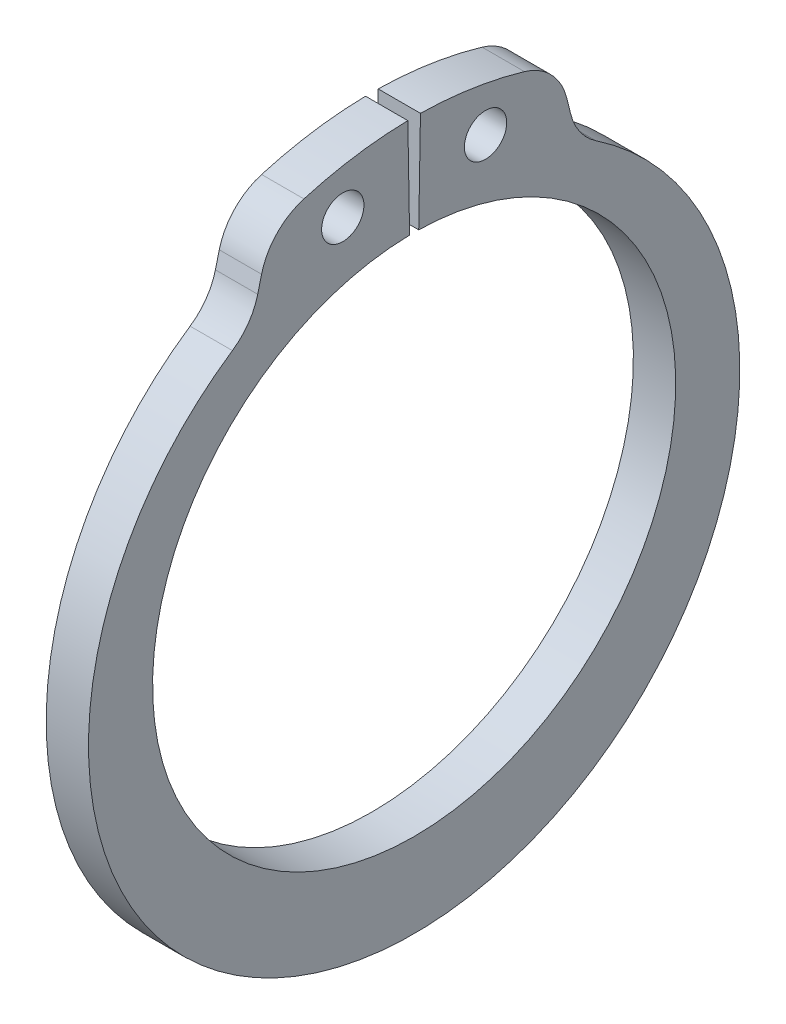
ISO-10303-21;
HEADER;
FILE_DESCRIPTION(('STEP AP214'),'2;1');
FILE_NAME('part.step','',(''),(''),'','','');
FILE_SCHEMA(('AUTOMOTIVE_DESIGN { 1 0 10303 214 1 1 1 1 }'));
ENDSEC;
DATA;
#1=APPLICATION_CONTEXT('core data for automotive mechanical design processes');
#2=APPLICATION_PROTOCOL_DEFINITION('international standard','automotive_design',2000,#1);
#3=PRODUCT_CONTEXT('',#1,'mechanical');
#4=PRODUCT('Part','Part','',(#3));
#5=PRODUCT_RELATED_PRODUCT_CATEGORY('part','',(#4));
#6=PRODUCT_DEFINITION_FORMATION('','',#4);
#7=PRODUCT_DEFINITION_CONTEXT('part definition',#1,'design');
#8=PRODUCT_DEFINITION('design','',#6,#7);
#9=PRODUCT_DEFINITION_SHAPE('','',#8);
#10=(LENGTH_UNIT() NAMED_UNIT(*) SI_UNIT(.MILLI.,.METRE.));
#11=(NAMED_UNIT(*) PLANE_ANGLE_UNIT() SI_UNIT($,.RADIAN.));
#12=(NAMED_UNIT(*) SI_UNIT($,.STERADIAN.) SOLID_ANGLE_UNIT());
#13=UNCERTAINTY_MEASURE_WITH_UNIT(LENGTH_MEASURE(1.E-05),#10,'distance_accuracy_value','');
#14=(GEOMETRIC_REPRESENTATION_CONTEXT(3) GLOBAL_UNCERTAINTY_ASSIGNED_CONTEXT((#13)) GLOBAL_UNIT_ASSIGNED_CONTEXT((#10,
#11,#12)) REPRESENTATION_CONTEXT('',''));
#15=CARTESIAN_POINT('',(0.,0.,0.));
#16=DIRECTION('',(0.,0.,1.));
#17=DIRECTION('',(1.,0.,0.));
#18=AXIS2_PLACEMENT_3D('',#15,#16,#17);
#19=CARTESIAN_POINT('',(1.1811,0.,0.));
#20=DIRECTION('',(1.,0.,0.));
#21=DIRECTION('',(0.,0.,-1.));
#22=AXIS2_PLACEMENT_3D('',#19,#20,#21);
#23=PLANE('',#22);
#24=CARTESIAN_POINT('',(1.1811,17.3320681895196,3.98635962699142));
#25=DIRECTION('',(1.,0.,0.));
#26=DIRECTION('',(0.,0.,-1.));
#27=AXIS2_PLACEMENT_3D('',#24,#25,#26);
#28=CIRCLE('',#27,1.1811);
#29=CARTESIAN_POINT('',(1.1811,17.3320681895196,2.80525962699142));
#30=VERTEX_POINT('',#29);
#31=EDGE_CURVE('E218',#30,#30,#28,.T.);
#32=ORIENTED_EDGE('',*,*,#31,.F.);
#33=EDGE_LOOP('',(#32));
#34=FACE_BOUND('',#33,.T.);
#35=CARTESIAN_POINT('',(1.1811,-1.82915405372659,-0.0319280027715097));
#36=DIRECTION('',(1.,0.,0.));
#37=DIRECTION('',(0.,0.,-1.));
#38=AXIS2_PLACEMENT_3D('',#35,#36,#37);
#39=CIRCLE('',#38,22.0224326851856);
#40=CARTESIAN_POINT('',(1.1811,20.189924508293,0.352416443188067));
#41=VERTEX_POINT('',#40);
#42=CARTESIAN_POINT('',(1.1811,19.3059941721494,6.15620991131703));
#43=VERTEX_POINT('',#42);
#44=EDGE_CURVE('E135',#41,#43,#39,.T.);
#45=ORIENTED_EDGE('',*,*,#44,.T.);
#46=CARTESIAN_POINT('',(1.1811,16.0151486828007,5.19268670701256));
#47=DIRECTION('',(1.,0.,0.));
#48=DIRECTION('',(0.,0.,-1.));
#49=AXIS2_PLACEMENT_3D('',#46,#47,#48);
#50=CIRCLE('',#49,3.429);
#51=CARTESIAN_POINT('',(1.1811,16.844698862812,8.51983075241296));
#52=VERTEX_POINT('',#51);
#53=EDGE_CURVE('E172',#43,#52,#50,.T.);
#54=ORIENTED_EDGE('',*,*,#53,.T.);
#55=DIRECTION('',(0.,-0.970295726275998,0.241921895599662));
#56=VECTOR('',#55,1.);
#57=CARTESIAN_POINT('',(1.1811,18.6487841002765,8.07002178319707));
#58=LINE('',#57,#56);
#59=CARTESIAN_POINT('',(1.1811,15.9833165715134,8.73459747878691));
#60=VERTEX_POINT('',#59);
#61=EDGE_CURVE('E210',#52,#60,#58,.T.);
#62=ORIENTED_EDGE('',*,*,#61,.T.);
#63=CARTESIAN_POINT('',(1.1811,16.8128667515246,12.0617415241873));
#64=DIRECTION('',(1.,0.,0.));
#65=DIRECTION('',(0.,0.,-1.));
#66=AXIS2_PLACEMENT_3D('',#63,#64,#65);
#67=CIRCLE('',#66,3.429);
#68=CARTESIAN_POINT('',(1.1811,13.9675586664255,10.1480375499871));
#69=VERTEX_POINT('',#68);
#70=EDGE_CURVE('E183',#60,#69,#67,.F.);
#71=ORIENTED_EDGE('',*,*,#70,.T.);
#72=CARTESIAN_POINT('',(1.1811,-1.12061258583688,0.));
#73=DIRECTION('',(1.,0.,0.));
#74=DIRECTION('',(0.,0.,-1.));
#75=AXIS2_PLACEMENT_3D('',#72,#73,#74);
#76=CIRCLE('',#75,18.1833874141631);
#77=CARTESIAN_POINT('',(1.1811,13.9675586664254,-10.1480375499873));
#78=VERTEX_POINT('',#77);
#79=EDGE_CURVE('E205',#69,#78,#76,.T.);
#80=ORIENTED_EDGE('',*,*,#79,.T.);
#81=CARTESIAN_POINT('',(1.1811,16.8128667515244,-12.0617415241875));
#82=DIRECTION('',(1.,0.,0.));
#83=DIRECTION('',(0.,0.,-1.));
#84=AXIS2_PLACEMENT_3D('',#81,#82,#83);
#85=CIRCLE('',#84,3.429);
#86=CARTESIAN_POINT('',(1.1811,15.983316571513,-8.73459747878721));
#87=VERTEX_POINT('',#86);
#88=EDGE_CURVE('E11',#78,#87,#85,.F.);
#89=ORIENTED_EDGE('',*,*,#88,.T.);
#90=DIRECTION('',(0.,0.970295726275982,0.241921895599728));
#91=VECTOR('',#90,1.);
#92=CARTESIAN_POINT('',(1.1811,18.6487841002765,-8.07002178319708));
#93=LINE('',#92,#91);
#94=CARTESIAN_POINT('',(1.1811,16.8446988628121,-8.51983075241307));
#95=VERTEX_POINT('',#94);
#96=EDGE_CURVE('E204',#87,#95,#93,.T.);
#97=ORIENTED_EDGE('',*,*,#96,.T.);
#98=CARTESIAN_POINT('',(1.1811,16.0151486828006,-5.19268670701272));
#99=DIRECTION('',(1.,0.,0.));
#100=DIRECTION('',(0.,0.,-1.));
#101=AXIS2_PLACEMENT_3D('',#98,#99,#100);
#102=CIRCLE('',#101,3.429);
#103=CARTESIAN_POINT('',(1.1811,19.3059941721493,-6.15620991131715));
#104=VERTEX_POINT('',#103);
#105=EDGE_CURVE('E50',#95,#104,#102,.T.);
#106=ORIENTED_EDGE('',*,*,#105,.T.);
#107=CARTESIAN_POINT('',(1.1811,-1.82915405373175,0.0319280027725362));
#108=DIRECTION('',(1.,0.,0.));
#109=DIRECTION('',(0.,0.,1.));
#110=AXIS2_PLACEMENT_3D('',#107,#108,#109);
#111=CIRCLE('',#110,22.0224326851908);
#112=CARTESIAN_POINT('',(1.1811,20.189924508293,-0.352416443188068));
#113=VERTEX_POINT('',#112);
#114=EDGE_CURVE('E207',#104,#113,#111,.T.);
#115=ORIENTED_EDGE('',*,*,#114,.T.);
#116=DIRECTION('',(0.,-0.999847695156391,0.0174524064372836));
#117=VECTOR('',#116,1.);
#118=CARTESIAN_POINT('',(1.1811,20.189924508293,-0.352416443188067));
#119=LINE('',#118,#117);
#120=CARTESIAN_POINT('',(1.1811,14.6027755877591,-0.254892396016527));
#121=VERTEX_POINT('',#120);
#122=EDGE_CURVE('E141',#113,#121,#119,.T.);
#123=ORIENTED_EDGE('',*,*,#122,.T.);
#124=CARTESIAN_POINT('',(1.1811,0.,0.));
#125=DIRECTION('',(-1.,0.,0.));
#126=DIRECTION('',(0.,0.,-1.));
#127=AXIS2_PLACEMENT_3D('',#124,#125,#126);
#128=CIRCLE('',#127,14.605);
#129=CARTESIAN_POINT('',(1.1811,14.6027755877591,0.254892396016527));
#130=VERTEX_POINT('',#129);
#131=EDGE_CURVE('E136',#121,#130,#128,.T.);
#132=ORIENTED_EDGE('',*,*,#131,.T.);
#133=DIRECTION('',(0.,0.999847695156391,0.0174524064372836));
#134=VECTOR('',#133,1.);
#135=CARTESIAN_POINT('',(1.1811,14.6027755877591,0.254892396016527));
#136=LINE('',#135,#134);
#137=EDGE_CURVE('E125',#130,#41,#136,.T.);
#138=ORIENTED_EDGE('',*,*,#137,.T.);
#139=EDGE_LOOP('',(#45,#54,#62,#71,#80,#89,#97,#106,#115,#123,#132,#138));
#140=FACE_BOUND('',#139,.T.);
#141=CARTESIAN_POINT('',(1.1811,17.3320681895196,-3.98635962699142));
#142=DIRECTION('',(1.,0.,0.));
#143=DIRECTION('',(0.,0.,-1.));
#144=AXIS2_PLACEMENT_3D('',#141,#142,#143);
#145=CIRCLE('',#144,1.1811);
#146=CARTESIAN_POINT('',(1.1811,17.3320681895196,-5.16745962699142));
#147=VERTEX_POINT('',#146);
#148=EDGE_CURVE('E247',#147,#147,#145,.T.);
#149=ORIENTED_EDGE('',*,*,#148,.F.);
#150=EDGE_LOOP('',(#149));
#151=FACE_BOUND('',#150,.T.);
#152=ADVANCED_FACE('F35',(#34,#140,#151),#23,.T.);
#153=CARTESIAN_POINT('',(-1.1811,0.,0.));
#154=DIRECTION('',(1.,0.,0.));
#155=DIRECTION('',(0.,0.,-1.));
#156=AXIS2_PLACEMENT_3D('',#153,#154,#155);
#157=PLANE('',#156);
#158=CARTESIAN_POINT('',(-1.1811,17.3320681895196,3.98635962699142));
#159=DIRECTION('',(1.,0.,0.));
#160=DIRECTION('',(0.,0.,-1.));
#161=AXIS2_PLACEMENT_3D('',#158,#159,#160);
#162=CIRCLE('',#161,1.1811);
#163=CARTESIAN_POINT('',(-1.1811,17.3320681895196,2.80525962699142));
#164=VERTEX_POINT('',#163);
#165=EDGE_CURVE('E244',#164,#164,#162,.T.);
#166=ORIENTED_EDGE('',*,*,#165,.T.);
#167=EDGE_LOOP('',(#166));
#168=FACE_BOUND('',#167,.T.);
#169=DIRECTION('',(0.,-0.970295726275998,0.241921895599662));
#170=VECTOR('',#169,1.);
#171=CARTESIAN_POINT('',(-1.1811,18.6487841002765,8.07002178319707));
#172=LINE('',#171,#170);
#173=CARTESIAN_POINT('',(-1.1811,16.844698862812,8.51983075241296));
#174=VERTEX_POINT('',#173);
#175=CARTESIAN_POINT('',(-1.1811,15.9833165715134,8.73459747878691));
#176=VERTEX_POINT('',#175);
#177=EDGE_CURVE('E201',#174,#176,#172,.T.);
#178=ORIENTED_EDGE('',*,*,#177,.F.);
#179=CARTESIAN_POINT('',(-1.1811,16.0151486828007,5.19268670701256));
#180=DIRECTION('',(1.,0.,0.));
#181=DIRECTION('',(0.,0.,-1.));
#182=AXIS2_PLACEMENT_3D('',#179,#180,#181);
#183=CIRCLE('',#182,3.429);
#184=CARTESIAN_POINT('',(-1.1811,19.3059941721494,6.15620991131703));
#185=VERTEX_POINT('',#184);
#186=EDGE_CURVE('E167',#174,#185,#183,.F.);
#187=ORIENTED_EDGE('',*,*,#186,.T.);
#188=CARTESIAN_POINT('',(-1.1811,-1.82915405372659,-0.0319280027715097));
#189=DIRECTION('',(1.,0.,0.));
#190=DIRECTION('',(0.,0.,-1.));
#191=AXIS2_PLACEMENT_3D('',#188,#189,#190);
#192=CIRCLE('',#191,22.0224326851856);
#193=CARTESIAN_POINT('',(-1.1811,20.189924508293,0.352416443188067));
#194=VERTEX_POINT('',#193);
#195=EDGE_CURVE('E220',#194,#185,#192,.T.);
#196=ORIENTED_EDGE('',*,*,#195,.F.);
#197=DIRECTION('',(0.,0.999847695156391,0.0174524064372836));
#198=VECTOR('',#197,1.);
#199=CARTESIAN_POINT('',(-1.1811,14.6027755877591,0.254892396016527));
#200=LINE('',#199,#198);
#201=CARTESIAN_POINT('',(-1.1811,14.6027755877591,0.254892396016527));
#202=VERTEX_POINT('',#201);
#203=EDGE_CURVE('E217',#202,#194,#200,.T.);
#204=ORIENTED_EDGE('',*,*,#203,.F.);
#205=CARTESIAN_POINT('',(-1.1811,0.,0.));
#206=DIRECTION('',(-1.,0.,0.));
#207=DIRECTION('',(0.,0.,-1.));
#208=AXIS2_PLACEMENT_3D('',#205,#206,#207);
#209=CIRCLE('',#208,14.605);
#210=CARTESIAN_POINT('',(-1.1811,14.6027755877591,-0.254892396016527));
#211=VERTEX_POINT('',#210);
#212=EDGE_CURVE('E149',#211,#202,#209,.T.);
#213=ORIENTED_EDGE('',*,*,#212,.F.);
#214=DIRECTION('',(0.,-0.999847695156391,0.0174524064372836));
#215=VECTOR('',#214,1.);
#216=CARTESIAN_POINT('',(-1.1811,20.189924508293,-0.352416443188067));
#217=LINE('',#216,#215);
#218=CARTESIAN_POINT('',(-1.1811,20.189924508293,-0.352416443188068));
#219=VERTEX_POINT('',#218);
#220=EDGE_CURVE('E145',#219,#211,#217,.T.);
#221=ORIENTED_EDGE('',*,*,#220,.F.);
#222=CARTESIAN_POINT('',(-1.1811,-1.82915405373175,0.0319280027725362));
#223=DIRECTION('',(1.,0.,0.));
#224=DIRECTION('',(0.,0.,1.));
#225=AXIS2_PLACEMENT_3D('',#222,#223,#224);
#226=CIRCLE('',#225,22.0224326851908);
#227=CARTESIAN_POINT('',(-1.1811,19.3059941721493,-6.15620991131715));
#228=VERTEX_POINT('',#227);
#229=EDGE_CURVE('E226',#228,#219,#226,.T.);
#230=ORIENTED_EDGE('',*,*,#229,.F.);
#231=CARTESIAN_POINT('',(-1.1811,16.0151486828006,-5.19268670701272));
#232=DIRECTION('',(1.,0.,0.));
#233=DIRECTION('',(0.,0.,-1.));
#234=AXIS2_PLACEMENT_3D('',#231,#232,#233);
#235=CIRCLE('',#234,3.429);
#236=CARTESIAN_POINT('',(-1.1811,16.8446988628121,-8.51983075241307));
#237=VERTEX_POINT('',#236);
#238=EDGE_CURVE('E165',#228,#237,#235,.F.);
#239=ORIENTED_EDGE('',*,*,#238,.T.);
#240=DIRECTION('',(0.,0.970295726275982,0.241921895599728));
#241=VECTOR('',#240,1.);
#242=CARTESIAN_POINT('',(-1.1811,18.6487841002765,-8.07002178319708));
#243=LINE('',#242,#241);
#244=CARTESIAN_POINT('',(-1.1811,15.983316571513,-8.73459747878721));
#245=VERTEX_POINT('',#244);
#246=EDGE_CURVE('E192',#245,#237,#243,.T.);
#247=ORIENTED_EDGE('',*,*,#246,.F.);
#248=CARTESIAN_POINT('',(-1.1811,16.8128667515244,-12.0617415241875));
#249=DIRECTION('',(1.,0.,0.));
#250=DIRECTION('',(0.,0.,-1.));
#251=AXIS2_PLACEMENT_3D('',#248,#249,#250);
#252=CIRCLE('',#251,3.429);
#253=CARTESIAN_POINT('',(-1.1811,13.9675586664254,-10.1480375499873));
#254=VERTEX_POINT('',#253);
#255=EDGE_CURVE('E43',#245,#254,#252,.T.);
#256=ORIENTED_EDGE('',*,*,#255,.T.);
#257=CARTESIAN_POINT('',(-1.1811,-1.12061258583688,0.));
#258=DIRECTION('',(1.,0.,0.));
#259=DIRECTION('',(0.,0.,-1.));
#260=AXIS2_PLACEMENT_3D('',#257,#258,#259);
#261=CIRCLE('',#260,18.1833874141631);
#262=CARTESIAN_POINT('',(-1.1811,13.9675586664255,10.1480375499871));
#263=VERTEX_POINT('',#262);
#264=EDGE_CURVE('E191',#263,#254,#261,.T.);
#265=ORIENTED_EDGE('',*,*,#264,.F.);
#266=CARTESIAN_POINT('',(-1.1811,16.8128667515246,12.0617415241873));
#267=DIRECTION('',(1.,0.,0.));
#268=DIRECTION('',(0.,0.,-1.));
#269=AXIS2_PLACEMENT_3D('',#266,#267,#268);
#270=CIRCLE('',#269,3.429);
#271=EDGE_CURVE('E181',#263,#176,#270,.T.);
#272=ORIENTED_EDGE('',*,*,#271,.T.);
#273=EDGE_LOOP('',(#178,#187,#196,#204,#213,#221,#230,#239,#247,#256,#265,#272));
#274=FACE_BOUND('',#273,.T.);
#275=CARTESIAN_POINT('',(-1.1811,17.3320681895196,-3.98635962699142));
#276=DIRECTION('',(1.,0.,0.));
#277=DIRECTION('',(0.,0.,-1.));
#278=AXIS2_PLACEMENT_3D('',#275,#276,#277);
#279=CIRCLE('',#278,1.1811);
#280=CARTESIAN_POINT('',(-1.1811,17.3320681895196,-5.16745962699142));
#281=VERTEX_POINT('',#280);
#282=EDGE_CURVE('E250',#281,#281,#279,.T.);
#283=ORIENTED_EDGE('',*,*,#282,.T.);
#284=EDGE_LOOP('',(#283));
#285=FACE_BOUND('',#284,.T.);
#286=ADVANCED_FACE('F189',(#168,#274,#285),#157,.F.);
#287=CARTESIAN_POINT('',(1.1811,0.,0.));
#288=DIRECTION('',(-1.,0.,0.));
#289=DIRECTION('',(0.,0.,1.));
#290=AXIS2_PLACEMENT_3D('',#287,#288,#289);
#291=CYLINDRICAL_SURFACE('',#290,14.605);
#292=ORIENTED_EDGE('',*,*,#212,.T.);
#293=DIRECTION('',(-1.,0.,0.));
#294=VECTOR('',#293,1.);
#295=CARTESIAN_POINT('',(1.1811,14.6027755877591,0.254892396016527));
#296=LINE('',#295,#294);
#297=EDGE_CURVE('E129',#130,#202,#296,.T.);
#298=ORIENTED_EDGE('',*,*,#297,.F.);
#299=ORIENTED_EDGE('',*,*,#131,.F.);
#300=DIRECTION('',(-1.,0.,0.));
#301=VECTOR('',#300,1.);
#302=CARTESIAN_POINT('',(1.1811,14.6027755877591,-0.254892396016527));
#303=LINE('',#302,#301);
#304=EDGE_CURVE('E215',#121,#211,#303,.T.);
#305=ORIENTED_EDGE('',*,*,#304,.T.);
#306=EDGE_LOOP('',(#292,#298,#299,#305));
#307=FACE_BOUND('',#306,.T.);
#308=ADVANCED_FACE('F147',(#307),#291,.F.);
#309=CARTESIAN_POINT('',(1.1811,14.6027755877591,0.254892396016527));
#310=DIRECTION('',(0.,-0.0174524064372836,0.999847695156391));
#311=DIRECTION('',(0.,-0.999847695156391,-0.0174524064372836));
#312=AXIS2_PLACEMENT_3D('',#309,#310,#311);
#313=PLANE('',#312);
#314=ORIENTED_EDGE('',*,*,#203,.T.);
#315=DIRECTION('',(-1.,0.,0.));
#316=VECTOR('',#315,1.);
#317=CARTESIAN_POINT('',(1.1811,20.189924508293,0.352416443188067));
#318=LINE('',#317,#316);
#319=EDGE_CURVE('E132',#41,#194,#318,.T.);
#320=ORIENTED_EDGE('',*,*,#319,.F.);
#321=ORIENTED_EDGE('',*,*,#137,.F.);
#322=ORIENTED_EDGE('',*,*,#297,.T.);
#323=EDGE_LOOP('',(#314,#320,#321,#322));
#324=FACE_BOUND('',#323,.T.);
#325=ADVANCED_FACE('F127',(#324),#313,.F.);
#326=CARTESIAN_POINT('',(1.1811,-1.82915405372659,-0.0319280027715097));
#327=DIRECTION('',(-1.,0.,0.));
#328=DIRECTION('',(0.,0.,1.));
#329=AXIS2_PLACEMENT_3D('',#326,#327,#328);
#330=CYLINDRICAL_SURFACE('',#329,22.0224326851856);
#331=ORIENTED_EDGE('',*,*,#195,.T.);
#332=DIRECTION('',(-1.,0.,0.));
#333=VECTOR('',#332,1.);
#334=CARTESIAN_POINT('',(1.1811,19.3059941721494,6.15620991131703));
#335=LINE('',#334,#333);
#336=EDGE_CURVE('E169',#185,#43,#335,.F.);
#337=ORIENTED_EDGE('',*,*,#336,.T.);
#338=ORIENTED_EDGE('',*,*,#44,.F.);
#339=ORIENTED_EDGE('',*,*,#319,.T.);
#340=EDGE_LOOP('',(#331,#337,#338,#339));
#341=FACE_BOUND('',#340,.T.);
#342=ADVANCED_FACE('F238',(#341),#330,.T.);
#343=CARTESIAN_POINT('',(1.1811,18.6487841002765,8.07002178319707));
#344=DIRECTION('',(0.,-0.241921895599662,-0.970295726275998));
#345=DIRECTION('',(0.,0.970295726275998,-0.241921895599662));
#346=AXIS2_PLACEMENT_3D('',#343,#344,#345);
#347=PLANE('',#346);
#348=ORIENTED_EDGE('',*,*,#177,.T.);
#349=DIRECTION('',(1.,0.,0.));
#350=VECTOR('',#349,1.);
#351=CARTESIAN_POINT('',(1.1811,15.9833165715134,8.73459747878691));
#352=LINE('',#351,#350);
#353=EDGE_CURVE('E163',#176,#60,#352,.T.);
#354=ORIENTED_EDGE('',*,*,#353,.T.);
#355=ORIENTED_EDGE('',*,*,#61,.F.);
#356=DIRECTION('',(-1.,0.,0.));
#357=VECTOR('',#356,1.);
#358=CARTESIAN_POINT('',(1.1811,16.844698862812,8.51983075241296));
#359=LINE('',#358,#357);
#360=EDGE_CURVE('E160',#52,#174,#359,.T.);
#361=ORIENTED_EDGE('',*,*,#360,.T.);
#362=EDGE_LOOP('',(#348,#354,#355,#361));
#363=FACE_BOUND('',#362,.T.);
#364=ADVANCED_FACE('F280',(#363),#347,.F.);
#365=CARTESIAN_POINT('',(1.1811,-1.12061258583688,0.));
#366=DIRECTION('',(-1.,0.,0.));
#367=DIRECTION('',(0.,0.,1.));
#368=AXIS2_PLACEMENT_3D('',#365,#366,#367);
#369=CYLINDRICAL_SURFACE('',#368,18.1833874141631);
#370=ORIENTED_EDGE('',*,*,#79,.F.);
#371=DIRECTION('',(-1.,0.,0.));
#372=VECTOR('',#371,1.);
#373=CARTESIAN_POINT('',(1.1811,13.9675586664255,10.1480375499871));
#374=LINE('',#373,#372);
#375=EDGE_CURVE('E152',#69,#263,#374,.T.);
#376=ORIENTED_EDGE('',*,*,#375,.T.);
#377=ORIENTED_EDGE('',*,*,#264,.T.);
#378=DIRECTION('',(-1.,0.,0.));
#379=VECTOR('',#378,1.);
#380=CARTESIAN_POINT('',(1.1811,13.9675586664254,-10.1480375499873));
#381=LINE('',#380,#379);
#382=EDGE_CURVE('E150',#254,#78,#381,.F.);
#383=ORIENTED_EDGE('',*,*,#382,.T.);
#384=EDGE_LOOP('',(#370,#376,#377,#383));
#385=FACE_BOUND('',#384,.T.);
#386=ADVANCED_FACE('F198',(#385),#369,.T.);
#387=CARTESIAN_POINT('',(1.1811,18.6487841002765,-8.07002178319708));
#388=DIRECTION('',(0.,-0.241921895599728,0.970295726275981));
#389=DIRECTION('',(0.,-0.970295726275982,-0.241921895599728));
#390=AXIS2_PLACEMENT_3D('',#387,#388,#389);
#391=PLANE('',#390);
#392=ORIENTED_EDGE('',*,*,#246,.T.);
#393=DIRECTION('',(-1.,0.,0.));
#394=VECTOR('',#393,1.);
#395=CARTESIAN_POINT('',(1.1811,16.8446988628121,-8.51983075241307));
#396=LINE('',#395,#394);
#397=EDGE_CURVE('E58',#237,#95,#396,.F.);
#398=ORIENTED_EDGE('',*,*,#397,.T.);
#399=ORIENTED_EDGE('',*,*,#96,.F.);
#400=DIRECTION('',(1.,0.,0.));
#401=VECTOR('',#400,1.);
#402=CARTESIAN_POINT('',(-1.1811,15.983316571513,-8.73459747878721));
#403=LINE('',#402,#401);
#404=EDGE_CURVE('E177',#87,#245,#403,.F.);
#405=ORIENTED_EDGE('',*,*,#404,.T.);
#406=EDGE_LOOP('',(#392,#398,#399,#405));
#407=FACE_BOUND('',#406,.T.);
#408=ADVANCED_FACE('F206',(#407),#391,.F.);
#409=CARTESIAN_POINT('',(1.1811,-1.82915405373175,0.0319280027725362));
#410=DIRECTION('',(-1.,0.,0.));
#411=DIRECTION('',(0.,0.,1.));
#412=AXIS2_PLACEMENT_3D('',#409,#410,#411);
#413=CYLINDRICAL_SURFACE('',#412,22.0224326851908);
#414=ORIENTED_EDGE('',*,*,#114,.F.);
#415=DIRECTION('',(-1.,0.,0.));
#416=VECTOR('',#415,1.);
#417=CARTESIAN_POINT('',(1.1811,19.3059941721493,-6.15620991131715));
#418=LINE('',#417,#416);
#419=EDGE_CURVE('E174',#104,#228,#418,.T.);
#420=ORIENTED_EDGE('',*,*,#419,.T.);
#421=ORIENTED_EDGE('',*,*,#229,.T.);
#422=DIRECTION('',(-1.,0.,0.));
#423=VECTOR('',#422,1.);
#424=CARTESIAN_POINT('',(1.1811,20.189924508293,-0.352416443188068));
#425=LINE('',#424,#423);
#426=EDGE_CURVE('E154',#113,#219,#425,.T.);
#427=ORIENTED_EDGE('',*,*,#426,.F.);
#428=EDGE_LOOP('',(#414,#420,#421,#427));
#429=FACE_BOUND('',#428,.T.);
#430=ADVANCED_FACE('F273',(#429),#413,.T.);
#431=CARTESIAN_POINT('',(1.1811,20.189924508293,-0.352416443188067));
#432=DIRECTION('',(0.,-0.0174524064372836,-0.999847695156391));
#433=DIRECTION('',(0.,0.999847695156391,-0.0174524064372836));
#434=AXIS2_PLACEMENT_3D('',#431,#432,#433);
#435=PLANE('',#434);
#436=ORIENTED_EDGE('',*,*,#220,.T.);
#437=ORIENTED_EDGE('',*,*,#304,.F.);
#438=ORIENTED_EDGE('',*,*,#122,.F.);
#439=ORIENTED_EDGE('',*,*,#426,.T.);
#440=EDGE_LOOP('',(#436,#437,#438,#439));
#441=FACE_BOUND('',#440,.T.);
#442=ADVANCED_FACE('F233',(#441),#435,.F.);
#443=CARTESIAN_POINT('',(1.1811,17.3320681895196,3.98635962699142));
#444=DIRECTION('',(-1.,0.,0.));
#445=DIRECTION('',(0.,0.,1.));
#446=AXIS2_PLACEMENT_3D('',#443,#444,#445);
#447=CYLINDRICAL_SURFACE('',#446,1.1811);
#448=ORIENTED_EDGE('',*,*,#31,.T.);
#449=EDGE_LOOP('',(#448));
#450=FACE_BOUND('',#449,.T.);
#451=ORIENTED_EDGE('',*,*,#165,.F.);
#452=EDGE_LOOP('',(#451));
#453=FACE_BOUND('',#452,.T.);
#454=ADVANCED_FACE('F268',(#450,#453),#447,.F.);
#455=CARTESIAN_POINT('',(1.1811,17.3320681895196,-3.98635962699142));
#456=DIRECTION('',(-1.,0.,0.));
#457=DIRECTION('',(0.,0.,1.));
#458=AXIS2_PLACEMENT_3D('',#455,#456,#457);
#459=CYLINDRICAL_SURFACE('',#458,1.1811);
#460=ORIENTED_EDGE('',*,*,#148,.T.);
#461=EDGE_LOOP('',(#460));
#462=FACE_BOUND('',#461,.T.);
#463=ORIENTED_EDGE('',*,*,#282,.F.);
#464=EDGE_LOOP('',(#463));
#465=FACE_BOUND('',#464,.T.);
#466=ADVANCED_FACE('F256',(#462,#465),#459,.F.);
#467=CARTESIAN_POINT('',(1.1811,16.8128667515246,12.0617415241873));
#468=DIRECTION('',(-1.,0.,0.));
#469=DIRECTION('',(0.,0.,1.));
#470=AXIS2_PLACEMENT_3D('',#467,#468,#469);
#471=CYLINDRICAL_SURFACE('',#470,3.429);
#472=ORIENTED_EDGE('',*,*,#70,.F.);
#473=ORIENTED_EDGE('',*,*,#353,.F.);
#474=ORIENTED_EDGE('',*,*,#271,.F.);
#475=ORIENTED_EDGE('',*,*,#375,.F.);
#476=EDGE_LOOP('',(#472,#473,#474,#475));
#477=FACE_BOUND('',#476,.T.);
#478=ADVANCED_FACE('F290',(#477),#471,.F.);
#479=CARTESIAN_POINT('',(1.1811,16.0151486828007,5.19268670701256));
#480=DIRECTION('',(-1.,0.,0.));
#481=DIRECTION('',(0.,0.,1.));
#482=AXIS2_PLACEMENT_3D('',#479,#480,#481);
#483=CYLINDRICAL_SURFACE('',#482,3.429);
#484=ORIENTED_EDGE('',*,*,#53,.F.);
#485=ORIENTED_EDGE('',*,*,#336,.F.);
#486=ORIENTED_EDGE('',*,*,#186,.F.);
#487=ORIENTED_EDGE('',*,*,#360,.F.);
#488=EDGE_LOOP('',(#484,#485,#486,#487));
#489=FACE_BOUND('',#488,.T.);
#490=ADVANCED_FACE('F293',(#489),#483,.T.);
#491=CARTESIAN_POINT('',(1.1811,16.0151486828006,-5.19268670701272));
#492=DIRECTION('',(-1.,0.,0.));
#493=DIRECTION('',(0.,0.,1.));
#494=AXIS2_PLACEMENT_3D('',#491,#492,#493);
#495=CYLINDRICAL_SURFACE('',#494,3.429);
#496=ORIENTED_EDGE('',*,*,#105,.F.);
#497=ORIENTED_EDGE('',*,*,#397,.F.);
#498=ORIENTED_EDGE('',*,*,#238,.F.);
#499=ORIENTED_EDGE('',*,*,#419,.F.);
#500=EDGE_LOOP('',(#496,#497,#498,#499));
#501=FACE_BOUND('',#500,.T.);
#502=ADVANCED_FACE('F296',(#501),#495,.T.);
#503=CARTESIAN_POINT('',(1.1811,16.8128667515244,-12.0617415241875));
#504=DIRECTION('',(-1.,0.,0.));
#505=DIRECTION('',(0.,0.,1.));
#506=AXIS2_PLACEMENT_3D('',#503,#504,#505);
#507=CYLINDRICAL_SURFACE('',#506,3.429);
#508=ORIENTED_EDGE('',*,*,#88,.F.);
#509=ORIENTED_EDGE('',*,*,#382,.F.);
#510=ORIENTED_EDGE('',*,*,#255,.F.);
#511=ORIENTED_EDGE('',*,*,#404,.F.);
#512=EDGE_LOOP('',(#508,#509,#510,#511));
#513=FACE_BOUND('',#512,.T.);
#514=ADVANCED_FACE('F37',(#513),#507,.F.);
#515=CLOSED_SHELL('',(#152,#286,#308,#325,#342,#364,#386,#408,#430,#442,#454,#466,#478,#490,
#502,#514));
#516=MANIFOLD_SOLID_BREP('B2',#515);
#517=ADVANCED_BREP_SHAPE_REPRESENTATION('',(#18,#516),#14);
#518=SHAPE_DEFINITION_REPRESENTATION(#9,#517);
ENDSEC;
END-ISO-10303-21;
